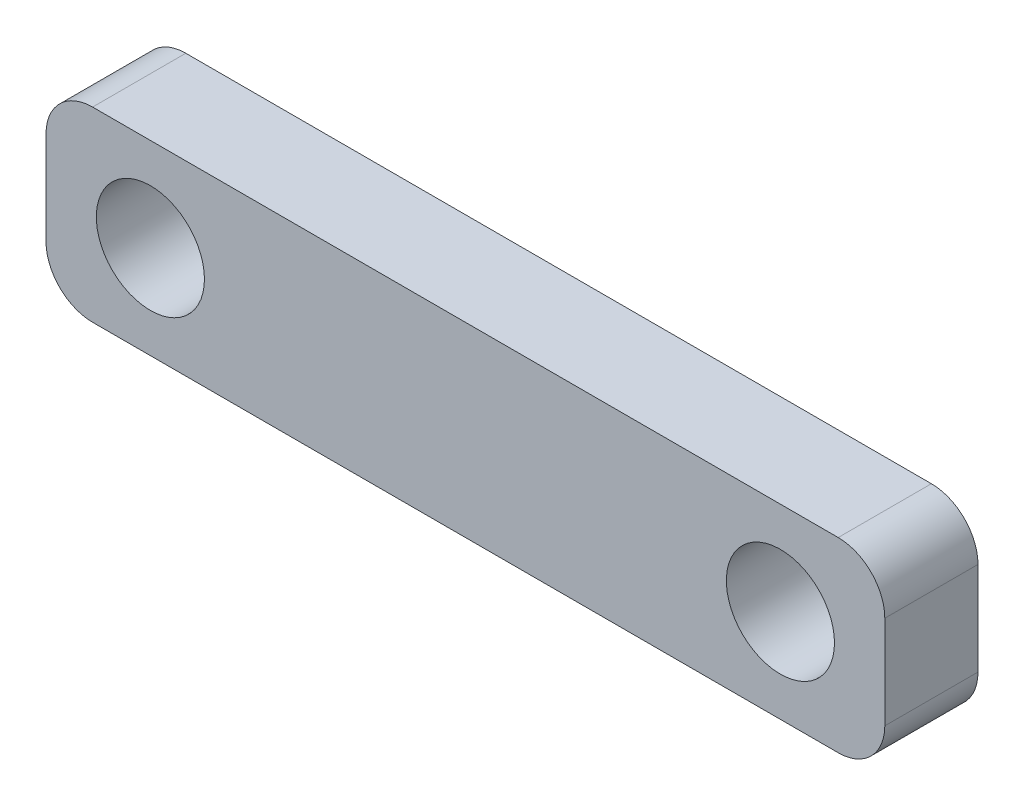
ISO-10303-21;
HEADER;
FILE_DESCRIPTION(('STEP AP214'),'2;1');
FILE_NAME('part.step','',(''),(''),'','','');
FILE_SCHEMA(('AUTOMOTIVE_DESIGN { 1 0 10303 214 1 1 1 1 }'));
ENDSEC;
DATA;
#1=APPLICATION_CONTEXT('core data for automotive mechanical design processes');
#2=APPLICATION_PROTOCOL_DEFINITION('international standard','automotive_design',2000,#1);
#3=PRODUCT_CONTEXT('',#1,'mechanical');
#4=PRODUCT('Part','Part','',(#3));
#5=PRODUCT_RELATED_PRODUCT_CATEGORY('part','',(#4));
#6=PRODUCT_DEFINITION_FORMATION('','',#4);
#7=PRODUCT_DEFINITION_CONTEXT('part definition',#1,'design');
#8=PRODUCT_DEFINITION('design','',#6,#7);
#9=PRODUCT_DEFINITION_SHAPE('','',#8);
#10=(LENGTH_UNIT() NAMED_UNIT(*) SI_UNIT(.MILLI.,.METRE.));
#11=(NAMED_UNIT(*) PLANE_ANGLE_UNIT() SI_UNIT($,.RADIAN.));
#12=(NAMED_UNIT(*) SI_UNIT($,.STERADIAN.) SOLID_ANGLE_UNIT());
#13=UNCERTAINTY_MEASURE_WITH_UNIT(LENGTH_MEASURE(1.E-05),#10,'distance_accuracy_value','');
#14=(GEOMETRIC_REPRESENTATION_CONTEXT(3) GLOBAL_UNCERTAINTY_ASSIGNED_CONTEXT((#13)) GLOBAL_UNIT_ASSIGNED_CONTEXT((#10,
#11,#12)) REPRESENTATION_CONTEXT('',''));
#15=CARTESIAN_POINT('',(0.,0.,0.));
#16=DIRECTION('',(0.,0.,1.));
#17=DIRECTION('',(1.,0.,0.));
#18=AXIS2_PLACEMENT_3D('',#15,#16,#17);
#19=CARTESIAN_POINT('',(7.14375,1.5875,1.5875));
#20=DIRECTION('',(-1.,0.,0.));
#21=DIRECTION('',(0.,-1.,0.));
#22=AXIS2_PLACEMENT_3D('',#19,#20,#21);
#23=PLANE('',#22);
#24=DIRECTION('',(0.,1.,0.));
#25=VECTOR('',#24,1.);
#26=CARTESIAN_POINT('',(7.14375,1.5875,1.5875));
#27=LINE('',#26,#25);
#28=CARTESIAN_POINT('',(7.14375,-0.793750000000001,1.5875));
#29=VERTEX_POINT('',#28);
#30=CARTESIAN_POINT('',(7.14375,0.793749999999999,1.5875));
#31=VERTEX_POINT('',#30);
#32=EDGE_CURVE('E117',#29,#31,#27,.T.);
#33=ORIENTED_EDGE('',*,*,#32,.F.);
#34=DIRECTION('',(0.,0.,-1.));
#35=VECTOR('',#34,1.);
#36=CARTESIAN_POINT('',(7.14375,-0.793750000000001,1.5875));
#37=LINE('',#36,#35);
#38=CARTESIAN_POINT('',(7.14375,-0.793750000000001,0.));
#39=VERTEX_POINT('',#38);
#40=EDGE_CURVE('E102',#29,#39,#37,.T.);
#41=ORIENTED_EDGE('',*,*,#40,.T.);
#42=DIRECTION('',(0.,1.,0.));
#43=VECTOR('',#42,1.);
#44=CARTESIAN_POINT('',(7.14375,1.5875,0.));
#45=LINE('',#44,#43);
#46=CARTESIAN_POINT('',(7.14375,0.793749999999999,0.));
#47=VERTEX_POINT('',#46);
#48=EDGE_CURVE('E114',#39,#47,#45,.T.);
#49=ORIENTED_EDGE('',*,*,#48,.T.);
#50=DIRECTION('',(0.,0.,-1.));
#51=VECTOR('',#50,1.);
#52=CARTESIAN_POINT('',(7.14375,0.793749999999999,1.5875));
#53=LINE('',#52,#51);
#54=EDGE_CURVE('E119',#47,#31,#53,.F.);
#55=ORIENTED_EDGE('',*,*,#54,.T.);
#56=EDGE_LOOP('',(#33,#41,#49,#55));
#57=FACE_BOUND('',#56,.T.);
#58=ADVANCED_FACE('F33',(#57),#23,.F.);
#59=CARTESIAN_POINT('',(-7.14375,1.5875,1.5875));
#60=DIRECTION('',(0.,-1.,0.));
#61=DIRECTION('',(0.,0.,-1.));
#62=AXIS2_PLACEMENT_3D('',#59,#60,#61);
#63=PLANE('',#62);
#64=DIRECTION('',(-1.,0.,0.));
#65=VECTOR('',#64,1.);
#66=CARTESIAN_POINT('',(-7.14375,1.5875,1.5875));
#67=LINE('',#66,#65);
#68=CARTESIAN_POINT('',(6.35,1.5875,1.5875));
#69=VERTEX_POINT('',#68);
#70=CARTESIAN_POINT('',(-6.35,1.5875,1.5875));
#71=VERTEX_POINT('',#70);
#72=EDGE_CURVE('E172',#69,#71,#67,.T.);
#73=ORIENTED_EDGE('',*,*,#72,.F.);
#74=DIRECTION('',(0.,0.,-1.));
#75=VECTOR('',#74,1.);
#76=CARTESIAN_POINT('',(6.35,1.5875,1.5875));
#77=LINE('',#76,#75);
#78=CARTESIAN_POINT('',(6.35,1.5875,0.));
#79=VERTEX_POINT('',#78);
#80=EDGE_CURVE('E156',#69,#79,#77,.T.);
#81=ORIENTED_EDGE('',*,*,#80,.T.);
#82=DIRECTION('',(-1.,0.,0.));
#83=VECTOR('',#82,1.);
#84=CARTESIAN_POINT('',(-7.14375,1.5875,0.));
#85=LINE('',#84,#83);
#86=CARTESIAN_POINT('',(-6.35,1.5875,0.));
#87=VERTEX_POINT('',#86);
#88=EDGE_CURVE('E123',#79,#87,#85,.T.);
#89=ORIENTED_EDGE('',*,*,#88,.T.);
#90=DIRECTION('',(0.,0.,-1.));
#91=VECTOR('',#90,1.);
#92=CARTESIAN_POINT('',(-6.35,1.5875,1.5875));
#93=LINE('',#92,#91);
#94=EDGE_CURVE('E154',#87,#71,#93,.F.);
#95=ORIENTED_EDGE('',*,*,#94,.T.);
#96=EDGE_LOOP('',(#73,#81,#89,#95));
#97=FACE_BOUND('',#96,.T.);
#98=ADVANCED_FACE('F208',(#97),#63,.F.);
#99=CARTESIAN_POINT('',(-7.14375,1.5875,1.5875));
#100=DIRECTION('',(1.,0.,0.));
#101=DIRECTION('',(0.,0.,-1.));
#102=AXIS2_PLACEMENT_3D('',#99,#100,#101);
#103=PLANE('',#102);
#104=DIRECTION('',(0.,-1.,0.));
#105=VECTOR('',#104,1.);
#106=CARTESIAN_POINT('',(-7.14375,1.5875,0.));
#107=LINE('',#106,#105);
#108=CARTESIAN_POINT('',(-7.14375,0.79375,0.));
#109=VERTEX_POINT('',#108);
#110=CARTESIAN_POINT('',(-7.14375,-0.79375,0.));
#111=VERTEX_POINT('',#110);
#112=EDGE_CURVE('E127',#109,#111,#107,.T.);
#113=ORIENTED_EDGE('',*,*,#112,.T.);
#114=DIRECTION('',(0.,0.,-1.));
#115=VECTOR('',#114,1.);
#116=CARTESIAN_POINT('',(-7.14375,-0.79375,1.5875));
#117=LINE('',#116,#115);
#118=CARTESIAN_POINT('',(-7.14375,-0.79375,1.5875));
#119=VERTEX_POINT('',#118);
#120=EDGE_CURVE('E11',#111,#119,#117,.F.);
#121=ORIENTED_EDGE('',*,*,#120,.T.);
#122=DIRECTION('',(0.,-1.,0.));
#123=VECTOR('',#122,1.);
#124=CARTESIAN_POINT('',(-7.14375,1.5875,1.5875));
#125=LINE('',#124,#123);
#126=CARTESIAN_POINT('',(-7.14375,0.79375,1.5875));
#127=VERTEX_POINT('',#126);
#128=EDGE_CURVE('E162',#127,#119,#125,.T.);
#129=ORIENTED_EDGE('',*,*,#128,.F.);
#130=DIRECTION('',(0.,0.,-1.));
#131=VECTOR('',#130,1.);
#132=CARTESIAN_POINT('',(-7.14375,0.79375,1.5875));
#133=LINE('',#132,#131);
#134=EDGE_CURVE('E41',#127,#109,#133,.T.);
#135=ORIENTED_EDGE('',*,*,#134,.T.);
#136=EDGE_LOOP('',(#113,#121,#129,#135));
#137=FACE_BOUND('',#136,.T.);
#138=ADVANCED_FACE('F161',(#137),#103,.F.);
#139=CARTESIAN_POINT('',(-7.14375,-1.5875,1.5875));
#140=DIRECTION('',(0.,1.,0.));
#141=DIRECTION('',(0.,0.,1.));
#142=AXIS2_PLACEMENT_3D('',#139,#140,#141);
#143=PLANE('',#142);
#144=DIRECTION('',(1.,0.,0.));
#145=VECTOR('',#144,1.);
#146=CARTESIAN_POINT('',(-7.14375,-1.5875,0.));
#147=LINE('',#146,#145);
#148=CARTESIAN_POINT('',(-6.35,-1.5875,0.));
#149=VERTEX_POINT('',#148);
#150=CARTESIAN_POINT('',(6.35,-1.5875,0.));
#151=VERTEX_POINT('',#150);
#152=EDGE_CURVE('E137',#149,#151,#147,.T.);
#153=ORIENTED_EDGE('',*,*,#152,.T.);
#154=DIRECTION('',(0.,0.,-1.));
#155=VECTOR('',#154,1.);
#156=CARTESIAN_POINT('',(6.35,-1.5875,1.5875));
#157=LINE('',#156,#155);
#158=CARTESIAN_POINT('',(6.35,-1.5875,1.5875));
#159=VERTEX_POINT('',#158);
#160=EDGE_CURVE('E103',#151,#159,#157,.F.);
#161=ORIENTED_EDGE('',*,*,#160,.T.);
#162=DIRECTION('',(1.,0.,0.));
#163=VECTOR('',#162,1.);
#164=CARTESIAN_POINT('',(-7.14375,-1.5875,1.5875));
#165=LINE('',#164,#163);
#166=CARTESIAN_POINT('',(-6.35,-1.5875,1.5875));
#167=VERTEX_POINT('',#166);
#168=EDGE_CURVE('E133',#167,#159,#165,.T.);
#169=ORIENTED_EDGE('',*,*,#168,.F.);
#170=DIRECTION('',(0.,0.,-1.));
#171=VECTOR('',#170,1.);
#172=CARTESIAN_POINT('',(-6.35,-1.5875,1.5875));
#173=LINE('',#172,#171);
#174=EDGE_CURVE('E108',#167,#149,#173,.T.);
#175=ORIENTED_EDGE('',*,*,#174,.T.);
#176=EDGE_LOOP('',(#153,#161,#169,#175));
#177=FACE_BOUND('',#176,.T.);
#178=ADVANCED_FACE('F170',(#177),#143,.F.);
#179=CARTESIAN_POINT('',(0.,0.,1.5875));
#180=DIRECTION('',(0.,0.,1.));
#181=DIRECTION('',(1.,0.,0.));
#182=AXIS2_PLACEMENT_3D('',#179,#180,#181);
#183=PLANE('',#182);
#184=CARTESIAN_POINT('',(-5.36575,0.,1.5875));
#185=DIRECTION('',(0.,0.,1.));
#186=DIRECTION('',(1.,0.,0.));
#187=AXIS2_PLACEMENT_3D('',#184,#185,#186);
#188=CIRCLE('',#187,0.92075);
#189=CARTESIAN_POINT('',(-4.445,0.,1.5875));
#190=VERTEX_POINT('',#189);
#191=EDGE_CURVE('E130',#190,#190,#188,.T.);
#192=ORIENTED_EDGE('',*,*,#191,.F.);
#193=EDGE_LOOP('',(#192));
#194=FACE_BOUND('',#193,.T.);
#195=CARTESIAN_POINT('',(5.36575,0.,1.5875));
#196=DIRECTION('',(0.,0.,1.));
#197=DIRECTION('',(1.,0.,0.));
#198=AXIS2_PLACEMENT_3D('',#195,#196,#197);
#199=CIRCLE('',#198,0.920750000000001);
#200=CARTESIAN_POINT('',(6.2865,0.,1.5875));
#201=VERTEX_POINT('',#200);
#202=EDGE_CURVE('E179',#201,#201,#199,.T.);
#203=ORIENTED_EDGE('',*,*,#202,.F.);
#204=EDGE_LOOP('',(#203));
#205=FACE_BOUND('',#204,.T.);
#206=ORIENTED_EDGE('',*,*,#168,.T.);
#207=CARTESIAN_POINT('',(6.35,-0.79375,1.5875));
#208=DIRECTION('',(0.,0.,1.));
#209=DIRECTION('',(1.,0.,0.));
#210=AXIS2_PLACEMENT_3D('',#207,#208,#209);
#211=CIRCLE('',#210,0.79375);
#212=EDGE_CURVE('E152',#159,#29,#211,.T.);
#213=ORIENTED_EDGE('',*,*,#212,.T.);
#214=ORIENTED_EDGE('',*,*,#32,.T.);
#215=CARTESIAN_POINT('',(6.35,0.79375,1.5875));
#216=DIRECTION('',(0.,0.,1.));
#217=DIRECTION('',(1.,0.,0.));
#218=AXIS2_PLACEMENT_3D('',#215,#216,#217);
#219=CIRCLE('',#218,0.79375);
#220=EDGE_CURVE('E150',#31,#69,#219,.T.);
#221=ORIENTED_EDGE('',*,*,#220,.T.);
#222=ORIENTED_EDGE('',*,*,#72,.T.);
#223=CARTESIAN_POINT('',(-6.35,0.79375,1.5875));
#224=DIRECTION('',(0.,0.,1.));
#225=DIRECTION('',(1.,0.,0.));
#226=AXIS2_PLACEMENT_3D('',#223,#224,#225);
#227=CIRCLE('',#226,0.79375);
#228=EDGE_CURVE('E53',#71,#127,#227,.T.);
#229=ORIENTED_EDGE('',*,*,#228,.T.);
#230=ORIENTED_EDGE('',*,*,#128,.T.);
#231=CARTESIAN_POINT('',(-6.35,-0.79375,1.5875));
#232=DIRECTION('',(0.,0.,1.));
#233=DIRECTION('',(1.,0.,0.));
#234=AXIS2_PLACEMENT_3D('',#231,#232,#233);
#235=CIRCLE('',#234,0.79375);
#236=EDGE_CURVE('E148',#119,#167,#235,.T.);
#237=ORIENTED_EDGE('',*,*,#236,.T.);
#238=EDGE_LOOP('',(#206,#213,#214,#221,#222,#229,#230,#237));
#239=FACE_BOUND('',#238,.T.);
#240=ADVANCED_FACE('F188',(#194,#205,#239),#183,.T.);
#241=CARTESIAN_POINT('',(0.,0.,0.));
#242=DIRECTION('',(0.,0.,1.));
#243=DIRECTION('',(1.,0.,0.));
#244=AXIS2_PLACEMENT_3D('',#241,#242,#243);
#245=PLANE('',#244);
#246=CARTESIAN_POINT('',(-5.36575,0.,0.));
#247=DIRECTION('',(0.,0.,1.));
#248=DIRECTION('',(1.,0.,0.));
#249=AXIS2_PLACEMENT_3D('',#246,#247,#248);
#250=CIRCLE('',#249,0.92075);
#251=CARTESIAN_POINT('',(-4.445,0.,0.));
#252=VERTEX_POINT('',#251);
#253=EDGE_CURVE('E124',#252,#252,#250,.F.);
#254=ORIENTED_EDGE('',*,*,#253,.F.);
#255=EDGE_LOOP('',(#254));
#256=FACE_BOUND('',#255,.T.);
#257=CARTESIAN_POINT('',(5.36575,0.,0.));
#258=DIRECTION('',(0.,0.,1.));
#259=DIRECTION('',(1.,0.,0.));
#260=AXIS2_PLACEMENT_3D('',#257,#258,#259);
#261=CIRCLE('',#260,0.920750000000001);
#262=CARTESIAN_POINT('',(6.2865,0.,0.));
#263=VERTEX_POINT('',#262);
#264=EDGE_CURVE('E176',#263,#263,#261,.F.);
#265=ORIENTED_EDGE('',*,*,#264,.F.);
#266=EDGE_LOOP('',(#265));
#267=FACE_BOUND('',#266,.T.);
#268=ORIENTED_EDGE('',*,*,#48,.F.);
#269=CARTESIAN_POINT('',(6.35,-0.79375,0.));
#270=DIRECTION('',(0.,0.,1.));
#271=DIRECTION('',(1.,0.,0.));
#272=AXIS2_PLACEMENT_3D('',#269,#270,#271);
#273=CIRCLE('',#272,0.79375);
#274=EDGE_CURVE('E98',#39,#151,#273,.F.);
#275=ORIENTED_EDGE('',*,*,#274,.T.);
#276=ORIENTED_EDGE('',*,*,#152,.F.);
#277=CARTESIAN_POINT('',(-6.35,-0.79375,0.));
#278=DIRECTION('',(0.,0.,1.));
#279=DIRECTION('',(1.,0.,0.));
#280=AXIS2_PLACEMENT_3D('',#277,#278,#279);
#281=CIRCLE('',#280,0.79375);
#282=EDGE_CURVE('E141',#149,#111,#281,.F.);
#283=ORIENTED_EDGE('',*,*,#282,.T.);
#284=ORIENTED_EDGE('',*,*,#112,.F.);
#285=CARTESIAN_POINT('',(-6.35,0.79375,0.));
#286=DIRECTION('',(0.,0.,1.));
#287=DIRECTION('',(1.,0.,0.));
#288=AXIS2_PLACEMENT_3D('',#285,#286,#287);
#289=CIRCLE('',#288,0.79375);
#290=EDGE_CURVE('E118',#109,#87,#289,.F.);
#291=ORIENTED_EDGE('',*,*,#290,.T.);
#292=ORIENTED_EDGE('',*,*,#88,.F.);
#293=CARTESIAN_POINT('',(6.35,0.79375,0.));
#294=DIRECTION('',(0.,0.,1.));
#295=DIRECTION('',(1.,0.,0.));
#296=AXIS2_PLACEMENT_3D('',#293,#294,#295);
#297=CIRCLE('',#296,0.79375);
#298=EDGE_CURVE('E109',#79,#47,#297,.F.);
#299=ORIENTED_EDGE('',*,*,#298,.T.);
#300=EDGE_LOOP('',(#268,#275,#276,#283,#284,#291,#292,#299));
#301=FACE_BOUND('',#300,.T.);
#302=ADVANCED_FACE('F121',(#256,#267,#301),#245,.F.);
#303=CARTESIAN_POINT('',(5.36575,0.,-0.000999999999999916));
#304=DIRECTION('',(0.,0.,1.));
#305=DIRECTION('',(1.,0.,0.));
#306=AXIS2_PLACEMENT_3D('',#303,#304,#305);
#307=CYLINDRICAL_SURFACE('',#306,0.920750000000001);
#308=ORIENTED_EDGE('',*,*,#202,.T.);
#309=EDGE_LOOP('',(#308));
#310=FACE_BOUND('',#309,.T.);
#311=ORIENTED_EDGE('',*,*,#264,.T.);
#312=EDGE_LOOP('',(#311));
#313=FACE_BOUND('',#312,.T.);
#314=ADVANCED_FACE('F194',(#310,#313),#307,.F.);
#315=CARTESIAN_POINT('',(-5.36575,0.,-0.000999999999999916));
#316=DIRECTION('',(0.,0.,1.));
#317=DIRECTION('',(1.,0.,0.));
#318=AXIS2_PLACEMENT_3D('',#315,#316,#317);
#319=CYLINDRICAL_SURFACE('',#318,0.92075);
#320=ORIENTED_EDGE('',*,*,#191,.T.);
#321=EDGE_LOOP('',(#320));
#322=FACE_BOUND('',#321,.T.);
#323=ORIENTED_EDGE('',*,*,#253,.T.);
#324=EDGE_LOOP('',(#323));
#325=FACE_BOUND('',#324,.T.);
#326=ADVANCED_FACE('F185',(#322,#325),#319,.F.);
#327=CARTESIAN_POINT('',(6.35,-0.79375,1.5875));
#328=DIRECTION('',(0.,0.,-1.));
#329=DIRECTION('',(-1.,0.,0.));
#330=AXIS2_PLACEMENT_3D('',#327,#328,#329);
#331=CYLINDRICAL_SURFACE('',#330,0.79375);
#332=ORIENTED_EDGE('',*,*,#212,.F.);
#333=ORIENTED_EDGE('',*,*,#160,.F.);
#334=ORIENTED_EDGE('',*,*,#274,.F.);
#335=ORIENTED_EDGE('',*,*,#40,.F.);
#336=EDGE_LOOP('',(#332,#333,#334,#335));
#337=FACE_BOUND('',#336,.T.);
#338=ADVANCED_FACE('F101',(#337),#331,.T.);
#339=CARTESIAN_POINT('',(6.35,0.79375,1.5875));
#340=DIRECTION('',(0.,0.,-1.));
#341=DIRECTION('',(-1.,0.,0.));
#342=AXIS2_PLACEMENT_3D('',#339,#340,#341);
#343=CYLINDRICAL_SURFACE('',#342,0.79375);
#344=ORIENTED_EDGE('',*,*,#220,.F.);
#345=ORIENTED_EDGE('',*,*,#54,.F.);
#346=ORIENTED_EDGE('',*,*,#298,.F.);
#347=ORIENTED_EDGE('',*,*,#80,.F.);
#348=EDGE_LOOP('',(#344,#345,#346,#347));
#349=FACE_BOUND('',#348,.T.);
#350=ADVANCED_FACE('F219',(#349),#343,.T.);
#351=CARTESIAN_POINT('',(-6.35,-0.79375,1.5875));
#352=DIRECTION('',(0.,0.,-1.));
#353=DIRECTION('',(-1.,0.,0.));
#354=AXIS2_PLACEMENT_3D('',#351,#352,#353);
#355=CYLINDRICAL_SURFACE('',#354,0.79375);
#356=ORIENTED_EDGE('',*,*,#236,.F.);
#357=ORIENTED_EDGE('',*,*,#120,.F.);
#358=ORIENTED_EDGE('',*,*,#282,.F.);
#359=ORIENTED_EDGE('',*,*,#174,.F.);
#360=EDGE_LOOP('',(#356,#357,#358,#359));
#361=FACE_BOUND('',#360,.T.);
#362=ADVANCED_FACE('F167',(#361),#355,.T.);
#363=CARTESIAN_POINT('',(-6.35,0.79375,1.5875));
#364=DIRECTION('',(0.,0.,-1.));
#365=DIRECTION('',(-1.,0.,0.));
#366=AXIS2_PLACEMENT_3D('',#363,#364,#365);
#367=CYLINDRICAL_SURFACE('',#366,0.79375);
#368=ORIENTED_EDGE('',*,*,#228,.F.);
#369=ORIENTED_EDGE('',*,*,#94,.F.);
#370=ORIENTED_EDGE('',*,*,#290,.F.);
#371=ORIENTED_EDGE('',*,*,#134,.F.);
#372=EDGE_LOOP('',(#368,#369,#370,#371));
#373=FACE_BOUND('',#372,.T.);
#374=ADVANCED_FACE('F35',(#373),#367,.T.);
#375=CLOSED_SHELL('',(#58,#98,#138,#178,#240,#302,#314,#326,#338,#350,#362,#374));
#376=MANIFOLD_SOLID_BREP('B2',#375);
#377=ADVANCED_BREP_SHAPE_REPRESENTATION('',(#18,#376),#14);
#378=SHAPE_DEFINITION_REPRESENTATION(#9,#377);
ENDSEC;
END-ISO-10303-21;
